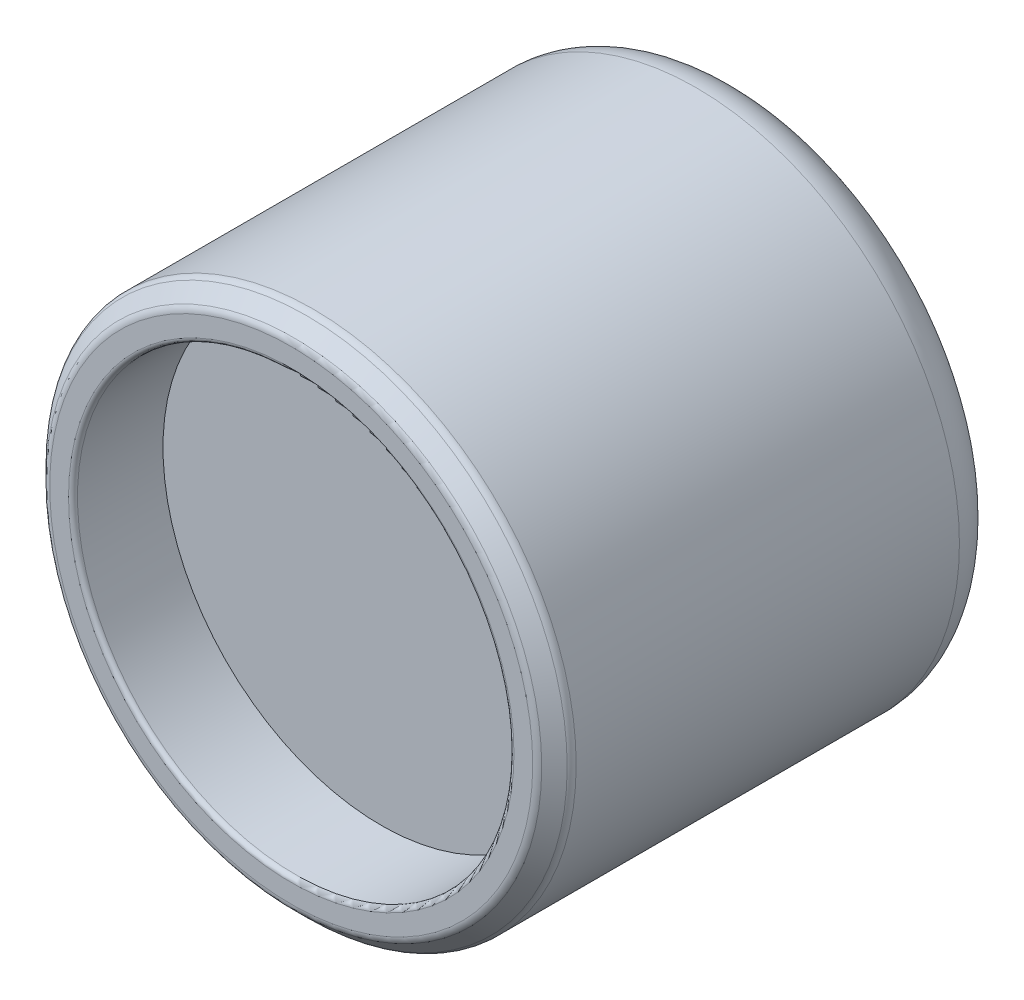
ISO-10303-21;
HEADER;
FILE_DESCRIPTION(('STEP AP214'),'2;1');
FILE_NAME('part.step','',(''),(''),'','','');
FILE_SCHEMA(('AUTOMOTIVE_DESIGN { 1 0 10303 214 1 1 1 1 }'));
ENDSEC;
DATA;
#1=APPLICATION_CONTEXT('core data for automotive mechanical design processes');
#2=APPLICATION_PROTOCOL_DEFINITION('international standard','automotive_design',2000,#1);
#3=PRODUCT_CONTEXT('',#1,'mechanical');
#4=PRODUCT('Part','Part','',(#3));
#5=PRODUCT_RELATED_PRODUCT_CATEGORY('part','',(#4));
#6=PRODUCT_DEFINITION_FORMATION('','',#4);
#7=PRODUCT_DEFINITION_CONTEXT('part definition',#1,'design');
#8=PRODUCT_DEFINITION('design','',#6,#7);
#9=PRODUCT_DEFINITION_SHAPE('','',#8);
#10=(LENGTH_UNIT() NAMED_UNIT(*) SI_UNIT(.MILLI.,.METRE.));
#11=(NAMED_UNIT(*) PLANE_ANGLE_UNIT() SI_UNIT($,.RADIAN.));
#12=(NAMED_UNIT(*) SI_UNIT($,.STERADIAN.) SOLID_ANGLE_UNIT());
#13=UNCERTAINTY_MEASURE_WITH_UNIT(LENGTH_MEASURE(1.E-05),#10,'distance_accuracy_value','');
#14=(GEOMETRIC_REPRESENTATION_CONTEXT(3) GLOBAL_UNCERTAINTY_ASSIGNED_CONTEXT((#13)) GLOBAL_UNIT_ASSIGNED_CONTEXT((#10,
#11,#12)) REPRESENTATION_CONTEXT('',''));
#15=CARTESIAN_POINT('',(0.,0.,0.));
#16=DIRECTION('',(0.,0.,1.));
#17=DIRECTION('',(1.,0.,0.));
#18=AXIS2_PLACEMENT_3D('',#15,#16,#17);
#19=CARTESIAN_POINT('',(0.,0.,100.));
#20=DIRECTION('',(0.,0.,-1.));
#21=DIRECTION('',(-1.,0.,0.));
#22=AXIS2_PLACEMENT_3D('',#19,#20,#21);
#23=CYLINDRICAL_SURFACE('',#22,58.5);
#24=CARTESIAN_POINT('',(0.,0.,9.99999999999999));
#25=DIRECTION('',(0.,0.,1.));
#26=DIRECTION('',(1.,0.,0.));
#27=AXIS2_PLACEMENT_3D('',#24,#25,#26);
#28=CIRCLE('',#27,58.5);
#29=CARTESIAN_POINT('',(58.5,0.,9.99999999999999));
#30=VERTEX_POINT('',#29);
#31=EDGE_CURVE('E46',#30,#30,#28,.T.);
#32=ORIENTED_EDGE('',*,*,#31,.T.);
#33=EDGE_LOOP('',(#32));
#34=FACE_BOUND('',#33,.T.);
#35=CARTESIAN_POINT('',(0.,0.,95.1715728752539));
#36=DIRECTION('',(0.,0.,1.));
#37=DIRECTION('',(1.,0.,0.));
#38=AXIS2_PLACEMENT_3D('',#35,#36,#37);
#39=CIRCLE('',#38,58.5);
#40=CARTESIAN_POINT('',(58.5,0.,95.1715728752539));
#41=VERTEX_POINT('',#40);
#42=EDGE_CURVE('E64',#41,#41,#39,.F.);
#43=ORIENTED_EDGE('',*,*,#42,.T.);
#44=EDGE_LOOP('',(#43));
#45=FACE_BOUND('',#44,.T.);
#46=ADVANCED_FACE('F39',(#34,#45),#23,.T.);
#47=CARTESIAN_POINT('',(0.,0.,100.));
#48=DIRECTION('',(0.,0.,1.));
#49=DIRECTION('',(1.,0.,0.));
#50=AXIS2_PLACEMENT_3D('',#47,#48,#49);
#51=PLANE('',#50);
#52=CARTESIAN_POINT('',(0.,0.,100.));
#53=DIRECTION('',(0.,0.,1.));
#54=DIRECTION('',(1.,0.,0.));
#55=AXIS2_PLACEMENT_3D('',#52,#53,#54);
#56=CIRCLE('',#55,53.6715728752539);
#57=CARTESIAN_POINT('',(53.6715728752539,0.,100.));
#58=VERTEX_POINT('',#57);
#59=EDGE_CURVE('E49',#58,#58,#56,.T.);
#60=ORIENTED_EDGE('',*,*,#59,.T.);
#61=EDGE_LOOP('',(#60));
#62=FACE_BOUND('',#61,.T.);
#63=CARTESIAN_POINT('',(0.,0.,100.));
#64=DIRECTION('',(0.,0.,1.));
#65=DIRECTION('',(1.,0.,0.));
#66=AXIS2_PLACEMENT_3D('',#63,#64,#65);
#67=CIRCLE('',#66,49.5);
#68=CARTESIAN_POINT('',(49.5,0.,100.));
#69=VERTEX_POINT('',#68);
#70=EDGE_CURVE('E63',#69,#69,#67,.F.);
#71=ORIENTED_EDGE('',*,*,#70,.T.);
#72=EDGE_LOOP('',(#71));
#73=FACE_BOUND('',#72,.T.);
#74=ADVANCED_FACE('F90',(#62,#73),#51,.T.);
#75=CARTESIAN_POINT('',(0.,0.,0.));
#76=DIRECTION('',(0.,0.,1.));
#77=DIRECTION('',(1.,0.,0.));
#78=AXIS2_PLACEMENT_3D('',#75,#76,#77);
#79=PLANE('',#78);
#80=CARTESIAN_POINT('',(0.,0.,0.));
#81=DIRECTION('',(0.,0.,1.));
#82=DIRECTION('',(1.,0.,0.));
#83=AXIS2_PLACEMENT_3D('',#80,#81,#82);
#84=CIRCLE('',#83,48.5);
#85=CARTESIAN_POINT('',(48.5,0.,0.));
#86=VERTEX_POINT('',#85);
#87=EDGE_CURVE('E10',#86,#86,#84,.F.);
#88=ORIENTED_EDGE('',*,*,#87,.T.);
#89=EDGE_LOOP('',(#88));
#90=FACE_BOUND('',#89,.T.);
#91=ADVANCED_FACE('F76',(#90),#79,.F.);
#92=CARTESIAN_POINT('',(0.,0.,80.));
#93=DIRECTION('',(0.,0.,1.));
#94=DIRECTION('',(1.,0.,0.));
#95=AXIS2_PLACEMENT_3D('',#92,#93,#94);
#96=CYLINDRICAL_SURFACE('',#95,48.5);
#97=CARTESIAN_POINT('',(0.,0.,99.));
#98=DIRECTION('',(0.,0.,1.));
#99=DIRECTION('',(1.,0.,0.));
#100=AXIS2_PLACEMENT_3D('',#97,#98,#99);
#101=CIRCLE('',#100,48.5);
#102=CARTESIAN_POINT('',(48.5,0.,99.));
#103=VERTEX_POINT('',#102);
#104=EDGE_CURVE('E66',#103,#103,#101,.T.);
#105=ORIENTED_EDGE('',*,*,#104,.T.);
#106=EDGE_LOOP('',(#105));
#107=FACE_BOUND('',#106,.T.);
#108=CARTESIAN_POINT('',(0.,0.,80.));
#109=DIRECTION('',(0.,0.,1.));
#110=DIRECTION('',(1.,0.,0.));
#111=AXIS2_PLACEMENT_3D('',#108,#109,#110);
#112=CIRCLE('',#111,48.5);
#113=CARTESIAN_POINT('',(48.5,0.,80.));
#114=VERTEX_POINT('',#113);
#115=EDGE_CURVE('E72',#114,#114,#112,.T.);
#116=ORIENTED_EDGE('',*,*,#115,.F.);
#117=EDGE_LOOP('',(#116));
#118=FACE_BOUND('',#117,.T.);
#119=ADVANCED_FACE('F79',(#107,#118),#96,.F.);
#120=CARTESIAN_POINT('',(0.,0.,80.));
#121=DIRECTION('',(0.,0.,1.));
#122=DIRECTION('',(1.,0.,0.));
#123=AXIS2_PLACEMENT_3D('',#120,#121,#122);
#124=PLANE('',#123);
#125=ORIENTED_EDGE('',*,*,#115,.T.);
#126=EDGE_LOOP('',(#125));
#127=FACE_BOUND('',#126,.T.);
#128=ADVANCED_FACE('F73',(#127),#124,.T.);
#129=CARTESIAN_POINT('',(0.,0.,99.));
#130=DIRECTION('',(0.,0.,1.));
#131=DIRECTION('',(1.,0.,0.));
#132=AXIS2_PLACEMENT_3D('',#129,#130,#131);
#133=TOROIDAL_SURFACE('',#132,49.5,1.);
#134=ORIENTED_EDGE('',*,*,#70,.F.);
#135=EDGE_LOOP('',(#134));
#136=FACE_BOUND('',#135,.T.);
#137=ORIENTED_EDGE('',*,*,#104,.F.);
#138=EDGE_LOOP('',(#137));
#139=FACE_BOUND('',#138,.T.);
#140=ADVANCED_FACE('F88',(#136,#139),#133,.T.);
#141=CARTESIAN_POINT('',(0.,0.,100.));
#142=DIRECTION('',(0.,0.,-1.));
#143=DIRECTION('',(-1.,0.,0.));
#144=AXIS2_PLACEMENT_3D('',#141,#142,#143);
#145=CONICAL_SURFACE('',#144,54.5,0.785398163397447);
#146=CARTESIAN_POINT('',(0.,0.,96.5857864376269));
#147=DIRECTION('',(0.,0.,-1.));
#148=DIRECTION('',(-1.,0.,0.));
#149=AXIS2_PLACEMENT_3D('',#146,#147,#148);
#150=CIRCLE('',#149,57.9142135623731);
#151=CARTESIAN_POINT('',(-57.9142135623731,0.,96.5857864376269));
#152=VERTEX_POINT('',#151);
#153=EDGE_CURVE('E53',#152,#152,#150,.F.);
#154=ORIENTED_EDGE('',*,*,#153,.T.);
#155=EDGE_LOOP('',(#154));
#156=FACE_BOUND('',#155,.T.);
#157=CARTESIAN_POINT('',(0.,0.,99.4142135623731));
#158=DIRECTION('',(0.,0.,1.));
#159=DIRECTION('',(1.,0.,0.));
#160=AXIS2_PLACEMENT_3D('',#157,#158,#159);
#161=CIRCLE('',#160,55.085786437627);
#162=CARTESIAN_POINT('',(55.085786437627,0.,99.4142135623731));
#163=VERTEX_POINT('',#162);
#164=EDGE_CURVE('E56',#163,#163,#161,.F.);
#165=ORIENTED_EDGE('',*,*,#164,.T.);
#166=EDGE_LOOP('',(#165));
#167=FACE_BOUND('',#166,.T.);
#168=ADVANCED_FACE('F105',(#156,#167),#145,.T.);
#169=CARTESIAN_POINT('',(0.,0.,95.1715728752539));
#170=DIRECTION('',(0.,0.,1.));
#171=DIRECTION('',(1.,0.,0.));
#172=AXIS2_PLACEMENT_3D('',#169,#170,#171);
#173=TOROIDAL_SURFACE('',#172,56.5,2.);
#174=ORIENTED_EDGE('',*,*,#153,.F.);
#175=EDGE_LOOP('',(#174));
#176=FACE_BOUND('',#175,.T.);
#177=ORIENTED_EDGE('',*,*,#42,.F.);
#178=EDGE_LOOP('',(#177));
#179=FACE_BOUND('',#178,.T.);
#180=ADVANCED_FACE('F108',(#176,#179),#173,.T.);
#181=CARTESIAN_POINT('',(0.,0.,98.));
#182=DIRECTION('',(0.,0.,1.));
#183=DIRECTION('',(1.,0.,0.));
#184=AXIS2_PLACEMENT_3D('',#181,#182,#183);
#185=TOROIDAL_SURFACE('',#184,53.6715728752539,2.);
#186=ORIENTED_EDGE('',*,*,#164,.F.);
#187=EDGE_LOOP('',(#186));
#188=FACE_BOUND('',#187,.T.);
#189=ORIENTED_EDGE('',*,*,#59,.F.);
#190=EDGE_LOOP('',(#189));
#191=FACE_BOUND('',#190,.T.);
#192=ADVANCED_FACE('F115',(#188,#191),#185,.T.);
#193=CARTESIAN_POINT('',(0.,0.,9.99999999999999));
#194=DIRECTION('',(0.,0.,1.));
#195=DIRECTION('',(1.,0.,0.));
#196=AXIS2_PLACEMENT_3D('',#193,#194,#195);
#197=TOROIDAL_SURFACE('',#196,48.5,10.);
#198=ORIENTED_EDGE('',*,*,#87,.F.);
#199=EDGE_LOOP('',(#198));
#200=FACE_BOUND('',#199,.T.);
#201=ORIENTED_EDGE('',*,*,#31,.F.);
#202=EDGE_LOOP('',(#201));
#203=FACE_BOUND('',#202,.T.);
#204=ADVANCED_FACE('F41',(#200,#203),#197,.T.);
#205=CLOSED_SHELL('',(#46,#74,#91,#119,#128,#140,#168,#180,#192,#204));
#206=MANIFOLD_SOLID_BREP('B2',#205);
#207=ADVANCED_BREP_SHAPE_REPRESENTATION('',(#18,#206),#14);
#208=SHAPE_DEFINITION_REPRESENTATION(#9,#207);
ENDSEC;
END-ISO-10303-21;
